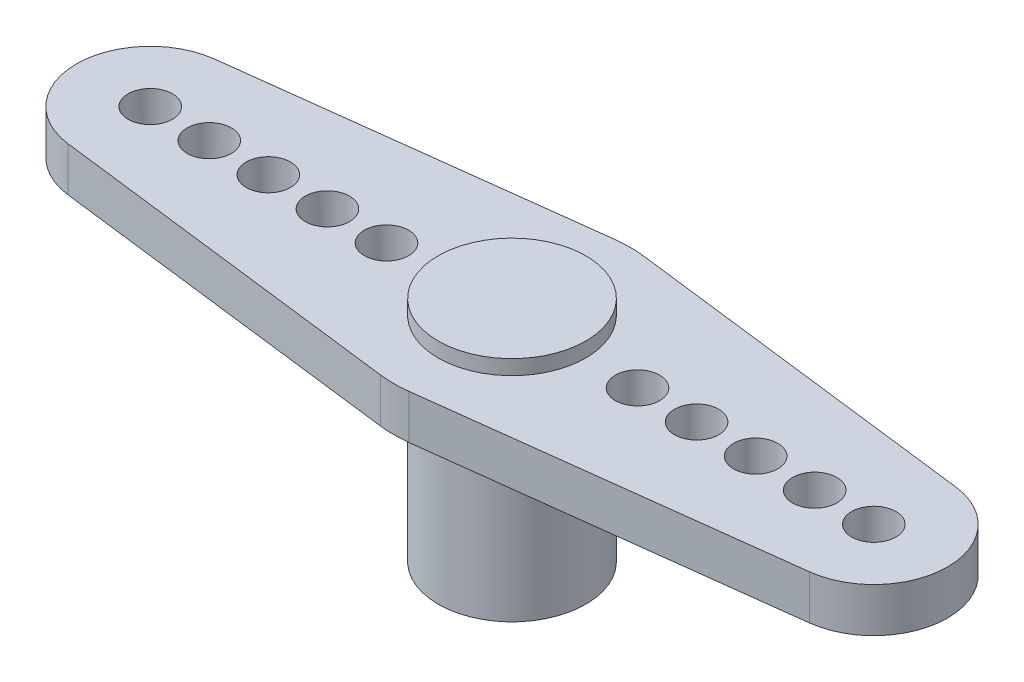
ISO-10303-21;
HEADER;
FILE_DESCRIPTION(('STEP AP214'),'2;1');
FILE_NAME('part.step','',(''),(''),'','','');
FILE_SCHEMA(('AUTOMOTIVE_DESIGN { 1 0 10303 214 1 1 1 1 }'));
ENDSEC;
DATA;
#1=APPLICATION_CONTEXT('core data for automotive mechanical design processes');
#2=APPLICATION_PROTOCOL_DEFINITION('international standard','automotive_design',2000,#1);
#3=PRODUCT_CONTEXT('',#1,'mechanical');
#4=PRODUCT('Part','Part','',(#3));
#5=PRODUCT_RELATED_PRODUCT_CATEGORY('part','',(#4));
#6=PRODUCT_DEFINITION_FORMATION('','',#4);
#7=PRODUCT_DEFINITION_CONTEXT('part definition',#1,'design');
#8=PRODUCT_DEFINITION('design','',#6,#7);
#9=PRODUCT_DEFINITION_SHAPE('','',#8);
#10=(LENGTH_UNIT() NAMED_UNIT(*) SI_UNIT(.MILLI.,.METRE.));
#11=(NAMED_UNIT(*) PLANE_ANGLE_UNIT() SI_UNIT($,.RADIAN.));
#12=(NAMED_UNIT(*) SI_UNIT($,.STERADIAN.) SOLID_ANGLE_UNIT());
#13=UNCERTAINTY_MEASURE_WITH_UNIT(LENGTH_MEASURE(1.E-05),#10,'distance_accuracy_value','');
#14=(GEOMETRIC_REPRESENTATION_CONTEXT(3) GLOBAL_UNCERTAINTY_ASSIGNED_CONTEXT((#13)) GLOBAL_UNIT_ASSIGNED_CONTEXT((#10,
#11,#12)) REPRESENTATION_CONTEXT('',''));
#15=CARTESIAN_POINT('',(0.,0.,0.));
#16=DIRECTION('',(0.,0.,1.));
#17=DIRECTION('',(1.,0.,0.));
#18=AXIS2_PLACEMENT_3D('',#15,#16,#17);
#19=CARTESIAN_POINT('',(0.,8.44,0.));
#20=DIRECTION('',(0.,-1.,0.));
#21=DIRECTION('',(0.,0.,-1.));
#22=AXIS2_PLACEMENT_3D('',#19,#20,#21);
#23=CYLINDRICAL_SURFACE('',#22,5.);
#24=CARTESIAN_POINT('',(0.,0.,0.));
#25=DIRECTION('',(0.,1.,0.));
#26=DIRECTION('',(0.,0.,1.));
#27=AXIS2_PLACEMENT_3D('',#24,#25,#26);
#28=CIRCLE('',#27,5.);
#29=CARTESIAN_POINT('',(0.,0.,5.));
#30=VERTEX_POINT('',#29);
#31=EDGE_CURVE('E43',#30,#30,#28,.T.);
#32=ORIENTED_EDGE('',*,*,#31,.T.);
#33=EDGE_LOOP('',(#32));
#34=FACE_BOUND('',#33,.T.);
#35=CARTESIAN_POINT('',(0.,11.44,0.));
#36=DIRECTION('',(0.,1.,0.));
#37=DIRECTION('',(0.,0.,1.));
#38=AXIS2_PLACEMENT_3D('',#35,#36,#37);
#39=CIRCLE('',#38,5.);
#40=CARTESIAN_POINT('',(0.,11.44,5.));
#41=VERTEX_POINT('',#40);
#42=EDGE_CURVE('E11',#41,#41,#39,.T.);
#43=ORIENTED_EDGE('',*,*,#42,.F.);
#44=EDGE_LOOP('',(#43));
#45=FACE_BOUND('',#44,.T.);
#46=ADVANCED_FACE('F35',(#34,#45),#23,.T.);
#47=CARTESIAN_POINT('',(0.,0.,0.));
#48=DIRECTION('',(0.,1.,0.));
#49=DIRECTION('',(0.,0.,1.));
#50=AXIS2_PLACEMENT_3D('',#47,#48,#49);
#51=PLANE('',#50);
#52=ORIENTED_EDGE('',*,*,#31,.F.);
#53=EDGE_LOOP('',(#52));
#54=FACE_BOUND('',#53,.T.);
#55=ADVANCED_FACE('F171',(#54),#51,.F.);
#56=CARTESIAN_POINT('',(0.,11.44,0.));
#57=DIRECTION('',(0.,1.,0.));
#58=DIRECTION('',(0.,0.,1.));
#59=AXIS2_PLACEMENT_3D('',#56,#57,#58);
#60=CYLINDRICAL_SURFACE('',#59,8.00000000000001);
#61=CARTESIAN_POINT('',(0.,14.44,0.));
#62=DIRECTION('',(0.,1.,0.));
#63=DIRECTION('',(0.,0.,1.));
#64=AXIS2_PLACEMENT_3D('',#61,#62,#63);
#65=CIRCLE('',#64,8.00000000000001);
#66=CARTESIAN_POINT('',(-0.979591836734696,14.44,7.93979847561655));
#67=VERTEX_POINT('',#66);
#68=CARTESIAN_POINT('',(0.979591836734696,14.44,7.93979847561655));
#69=VERTEX_POINT('',#68);
#70=EDGE_CURVE('E134',#67,#69,#65,.T.);
#71=ORIENTED_EDGE('',*,*,#70,.F.);
#72=DIRECTION('',(0.,1.,0.));
#73=VECTOR('',#72,1.);
#74=CARTESIAN_POINT('',(-0.979591836734696,11.44,7.93979847561655));
#75=LINE('',#74,#73);
#76=CARTESIAN_POINT('',(-0.979591836734696,11.44,7.93979847561655));
#77=VERTEX_POINT('',#76);
#78=EDGE_CURVE('E51',#77,#67,#75,.T.);
#79=ORIENTED_EDGE('',*,*,#78,.F.);
#80=CARTESIAN_POINT('',(0.,11.44,0.));
#81=DIRECTION('',(0.,1.,0.));
#82=DIRECTION('',(0.,0.,1.));
#83=AXIS2_PLACEMENT_3D('',#80,#81,#82);
#84=CIRCLE('',#83,8.00000000000001);
#85=CARTESIAN_POINT('',(0.979591836734696,11.44,7.93979847561655));
#86=VERTEX_POINT('',#85);
#87=EDGE_CURVE('E156',#77,#86,#84,.T.);
#88=ORIENTED_EDGE('',*,*,#87,.T.);
#89=DIRECTION('',(0.,1.,0.));
#90=VECTOR('',#89,1.);
#91=CARTESIAN_POINT('',(0.979591836734696,11.44,7.93979847561655));
#92=LINE('',#91,#90);
#93=EDGE_CURVE('E92',#86,#69,#92,.T.);
#94=ORIENTED_EDGE('',*,*,#93,.T.);
#95=EDGE_LOOP('',(#71,#79,#88,#94));
#96=FACE_BOUND('',#95,.T.);
#97=ADVANCED_FACE('F173',(#96),#60,.T.);
#98=CARTESIAN_POINT('',(-0.979591836734696,11.44,7.93979847561655));
#99=DIRECTION('',(-0.122448979591837,0.,0.992474809452068));
#100=DIRECTION('',(0.992474809452068,0.,0.122448979591837));
#101=AXIS2_PLACEMENT_3D('',#98,#99,#100);
#102=PLANE('',#101);
#103=DIRECTION('',(0.992474809452068,0.,0.122448979591837));
#104=VECTOR('',#103,1.);
#105=CARTESIAN_POINT('',(-0.979591836734696,14.44,7.93979847561655));
#106=LINE('',#105,#104);
#107=CARTESIAN_POINT('',(-25.1122448979592,14.44,4.96237404726034));
#108=VERTEX_POINT('',#107);
#109=EDGE_CURVE('E153',#108,#67,#106,.T.);
#110=ORIENTED_EDGE('',*,*,#109,.F.);
#111=DIRECTION('',(0.,1.,0.));
#112=VECTOR('',#111,1.);
#113=CARTESIAN_POINT('',(-25.1122448979592,11.44,4.96237404726034));
#114=LINE('',#113,#112);
#115=CARTESIAN_POINT('',(-25.1122448979592,11.44,4.96237404726034));
#116=VERTEX_POINT('',#115);
#117=EDGE_CURVE('E80',#116,#108,#114,.T.);
#118=ORIENTED_EDGE('',*,*,#117,.F.);
#119=DIRECTION('',(0.992474809452068,0.,0.122448979591837));
#120=VECTOR('',#119,1.);
#121=CARTESIAN_POINT('',(-0.979591836734696,11.44,7.93979847561655));
#122=LINE('',#121,#120);
#123=EDGE_CURVE('E124',#116,#77,#122,.T.);
#124=ORIENTED_EDGE('',*,*,#123,.T.);
#125=ORIENTED_EDGE('',*,*,#78,.T.);
#126=EDGE_LOOP('',(#110,#118,#124,#125));
#127=FACE_BOUND('',#126,.T.);
#128=ADVANCED_FACE('F178',(#127),#102,.T.);
#129=CARTESIAN_POINT('',(-24.5,11.44,0.));
#130=DIRECTION('',(0.,1.,0.));
#131=DIRECTION('',(0.,0.,1.));
#132=AXIS2_PLACEMENT_3D('',#129,#130,#131);
#133=CYLINDRICAL_SURFACE('',#132,5.);
#134=CARTESIAN_POINT('',(-24.5,14.44,0.));
#135=DIRECTION('',(0.,1.,0.));
#136=DIRECTION('',(0.,0.,1.));
#137=AXIS2_PLACEMENT_3D('',#134,#135,#136);
#138=CIRCLE('',#137,5.);
#139=CARTESIAN_POINT('',(-25.1122448979592,14.44,-4.96237404726034));
#140=VERTEX_POINT('',#139);
#141=EDGE_CURVE('E111',#140,#108,#138,.T.);
#142=ORIENTED_EDGE('',*,*,#141,.F.);
#143=DIRECTION('',(0.,1.,0.));
#144=VECTOR('',#143,1.);
#145=CARTESIAN_POINT('',(-25.1122448979592,11.44,-4.96237404726034));
#146=LINE('',#145,#144);
#147=CARTESIAN_POINT('',(-25.1122448979592,11.44,-4.96237404726034));
#148=VERTEX_POINT('',#147);
#149=EDGE_CURVE('E106',#148,#140,#146,.T.);
#150=ORIENTED_EDGE('',*,*,#149,.F.);
#151=CARTESIAN_POINT('',(-24.5,11.44,0.));
#152=DIRECTION('',(0.,1.,0.));
#153=DIRECTION('',(0.,0.,1.));
#154=AXIS2_PLACEMENT_3D('',#151,#152,#153);
#155=CIRCLE('',#154,5.);
#156=EDGE_CURVE('E109',#148,#116,#155,.T.);
#157=ORIENTED_EDGE('',*,*,#156,.T.);
#158=ORIENTED_EDGE('',*,*,#117,.T.);
#159=EDGE_LOOP('',(#142,#150,#157,#158));
#160=FACE_BOUND('',#159,.T.);
#161=ADVANCED_FACE('F108',(#160),#133,.T.);
#162=CARTESIAN_POINT('',(-0.979591836734696,11.44,-7.93979847561655));
#163=DIRECTION('',(-0.122448979591837,0.,-0.992474809452068));
#164=DIRECTION('',(-0.992474809452068,0.,0.122448979591837));
#165=AXIS2_PLACEMENT_3D('',#162,#163,#164);
#166=PLANE('',#165);
#167=DIRECTION('',(-0.992474809452068,0.,0.122448979591837));
#168=VECTOR('',#167,1.);
#169=CARTESIAN_POINT('',(-0.979591836734696,14.44,-7.93979847561655));
#170=LINE('',#169,#168);
#171=CARTESIAN_POINT('',(-0.979591836734696,14.44,-7.93979847561655));
#172=VERTEX_POINT('',#171);
#173=EDGE_CURVE('E150',#172,#140,#170,.T.);
#174=ORIENTED_EDGE('',*,*,#173,.F.);
#175=DIRECTION('',(0.,1.,0.));
#176=VECTOR('',#175,1.);
#177=CARTESIAN_POINT('',(-0.979591836734696,11.44,-7.93979847561655));
#178=LINE('',#177,#176);
#179=CARTESIAN_POINT('',(-0.979591836734696,11.44,-7.93979847561655));
#180=VERTEX_POINT('',#179);
#181=EDGE_CURVE('E116',#180,#172,#178,.T.);
#182=ORIENTED_EDGE('',*,*,#181,.F.);
#183=DIRECTION('',(-0.992474809452068,0.,0.122448979591837));
#184=VECTOR('',#183,1.);
#185=CARTESIAN_POINT('',(-0.979591836734696,11.44,-7.93979847561655));
#186=LINE('',#185,#184);
#187=EDGE_CURVE('E122',#180,#148,#186,.T.);
#188=ORIENTED_EDGE('',*,*,#187,.T.);
#189=ORIENTED_EDGE('',*,*,#149,.T.);
#190=EDGE_LOOP('',(#174,#182,#188,#189));
#191=FACE_BOUND('',#190,.T.);
#192=ADVANCED_FACE('F126',(#191),#166,.T.);
#193=CARTESIAN_POINT('',(0.,11.44,0.));
#194=DIRECTION('',(0.,1.,0.));
#195=DIRECTION('',(0.,0.,1.));
#196=AXIS2_PLACEMENT_3D('',#193,#194,#195);
#197=CYLINDRICAL_SURFACE('',#196,8.00000000000001);
#198=CARTESIAN_POINT('',(0.,14.44,0.));
#199=DIRECTION('',(0.,1.,0.));
#200=DIRECTION('',(0.,0.,-1.));
#201=AXIS2_PLACEMENT_3D('',#198,#199,#200);
#202=CIRCLE('',#201,8.00000000000001);
#203=CARTESIAN_POINT('',(0.979591836734698,14.44,-7.93979847561655));
#204=VERTEX_POINT('',#203);
#205=EDGE_CURVE('E147',#204,#172,#202,.T.);
#206=ORIENTED_EDGE('',*,*,#205,.F.);
#207=DIRECTION('',(0.,1.,0.));
#208=VECTOR('',#207,1.);
#209=CARTESIAN_POINT('',(0.979591836734698,11.44,-7.93979847561655));
#210=LINE('',#209,#208);
#211=CARTESIAN_POINT('',(0.979591836734698,11.44,-7.93979847561655));
#212=VERTEX_POINT('',#211);
#213=EDGE_CURVE('E160',#212,#204,#210,.T.);
#214=ORIENTED_EDGE('',*,*,#213,.F.);
#215=CARTESIAN_POINT('',(0.,11.44,0.));
#216=DIRECTION('',(0.,1.,0.));
#217=DIRECTION('',(0.,0.,-1.));
#218=AXIS2_PLACEMENT_3D('',#215,#216,#217);
#219=CIRCLE('',#218,8.00000000000001);
#220=EDGE_CURVE('E127',#212,#180,#219,.T.);
#221=ORIENTED_EDGE('',*,*,#220,.T.);
#222=ORIENTED_EDGE('',*,*,#181,.T.);
#223=EDGE_LOOP('',(#206,#214,#221,#222));
#224=FACE_BOUND('',#223,.T.);
#225=ADVANCED_FACE('F196',(#224),#197,.T.);
#226=CARTESIAN_POINT('',(0.979591836734696,11.44,-7.93979847561655));
#227=DIRECTION('',(0.122448979591837,0.,-0.992474809452068));
#228=DIRECTION('',(-0.992474809452068,0.,-0.122448979591837));
#229=AXIS2_PLACEMENT_3D('',#226,#227,#228);
#230=PLANE('',#229);
#231=DIRECTION('',(-0.992474809452068,0.,-0.122448979591837));
#232=VECTOR('',#231,1.);
#233=CARTESIAN_POINT('',(0.979591836734696,14.44,-7.93979847561655));
#234=LINE('',#233,#232);
#235=CARTESIAN_POINT('',(25.1122448979592,14.44,-4.96237404726034));
#236=VERTEX_POINT('',#235);
#237=EDGE_CURVE('E144',#236,#204,#234,.T.);
#238=ORIENTED_EDGE('',*,*,#237,.F.);
#239=DIRECTION('',(0.,1.,0.));
#240=VECTOR('',#239,1.);
#241=CARTESIAN_POINT('',(25.1122448979592,11.44,-4.96237404726034));
#242=LINE('',#241,#240);
#243=CARTESIAN_POINT('',(25.1122448979592,11.44,-4.96237404726034));
#244=VERTEX_POINT('',#243);
#245=EDGE_CURVE('E162',#244,#236,#242,.T.);
#246=ORIENTED_EDGE('',*,*,#245,.F.);
#247=DIRECTION('',(-0.992474809452068,0.,-0.122448979591837));
#248=VECTOR('',#247,1.);
#249=CARTESIAN_POINT('',(0.979591836734696,11.44,-7.93979847561655));
#250=LINE('',#249,#248);
#251=EDGE_CURVE('E129',#244,#212,#250,.T.);
#252=ORIENTED_EDGE('',*,*,#251,.T.);
#253=ORIENTED_EDGE('',*,*,#213,.T.);
#254=EDGE_LOOP('',(#238,#246,#252,#253));
#255=FACE_BOUND('',#254,.T.);
#256=ADVANCED_FACE('F192',(#255),#230,.T.);
#257=CARTESIAN_POINT('',(24.5,11.44,0.));
#258=DIRECTION('',(0.,1.,0.));
#259=DIRECTION('',(0.,0.,1.));
#260=AXIS2_PLACEMENT_3D('',#257,#258,#259);
#261=CYLINDRICAL_SURFACE('',#260,5.);
#262=CARTESIAN_POINT('',(24.5,14.44,0.));
#263=DIRECTION('',(0.,1.,0.));
#264=DIRECTION('',(0.,0.,-1.));
#265=AXIS2_PLACEMENT_3D('',#262,#263,#264);
#266=CIRCLE('',#265,5.);
#267=CARTESIAN_POINT('',(25.1122448979592,14.44,4.96237404726034));
#268=VERTEX_POINT('',#267);
#269=EDGE_CURVE('E141',#268,#236,#266,.T.);
#270=ORIENTED_EDGE('',*,*,#269,.F.);
#271=DIRECTION('',(0.,1.,0.));
#272=VECTOR('',#271,1.);
#273=CARTESIAN_POINT('',(25.1122448979592,11.44,4.96237404726034));
#274=LINE('',#273,#272);
#275=CARTESIAN_POINT('',(25.1122448979592,11.44,4.96237404726034));
#276=VERTEX_POINT('',#275);
#277=EDGE_CURVE('E164',#276,#268,#274,.T.);
#278=ORIENTED_EDGE('',*,*,#277,.F.);
#279=CARTESIAN_POINT('',(24.5,11.44,0.));
#280=DIRECTION('',(0.,1.,0.));
#281=DIRECTION('',(0.,0.,-1.));
#282=AXIS2_PLACEMENT_3D('',#279,#280,#281);
#283=CIRCLE('',#282,5.);
#284=EDGE_CURVE('E328',#276,#244,#283,.T.);
#285=ORIENTED_EDGE('',*,*,#284,.T.);
#286=ORIENTED_EDGE('',*,*,#245,.T.);
#287=EDGE_LOOP('',(#270,#278,#285,#286));
#288=FACE_BOUND('',#287,.T.);
#289=ADVANCED_FACE('F189',(#288),#261,.T.);
#290=CARTESIAN_POINT('',(0.979591836734696,11.44,7.93979847561655));
#291=DIRECTION('',(0.122448979591837,0.,0.992474809452068));
#292=DIRECTION('',(0.992474809452068,0.,-0.122448979591837));
#293=AXIS2_PLACEMENT_3D('',#290,#291,#292);
#294=PLANE('',#293);
#295=DIRECTION('',(0.992474809452068,0.,-0.122448979591837));
#296=VECTOR('',#295,1.);
#297=CARTESIAN_POINT('',(0.979591836734696,14.44,7.93979847561655));
#298=LINE('',#297,#296);
#299=EDGE_CURVE('E137',#69,#268,#298,.T.);
#300=ORIENTED_EDGE('',*,*,#299,.F.);
#301=ORIENTED_EDGE('',*,*,#93,.F.);
#302=DIRECTION('',(0.992474809452068,0.,-0.122448979591837));
#303=VECTOR('',#302,1.);
#304=CARTESIAN_POINT('',(0.979591836734696,11.44,7.93979847561655));
#305=LINE('',#304,#303);
#306=EDGE_CURVE('E326',#86,#276,#305,.T.);
#307=ORIENTED_EDGE('',*,*,#306,.T.);
#308=ORIENTED_EDGE('',*,*,#277,.T.);
#309=EDGE_LOOP('',(#300,#301,#307,#308));
#310=FACE_BOUND('',#309,.T.);
#311=ADVANCED_FACE('F186',(#310),#294,.T.);
#312=CARTESIAN_POINT('',(0.,11.44,0.));
#313=DIRECTION('',(0.,1.,0.));
#314=DIRECTION('',(0.,0.,1.));
#315=AXIS2_PLACEMENT_3D('',#312,#313,#314);
#316=PLANE('',#315);
#317=CARTESIAN_POINT('',(-20.5,11.44,0.));
#318=DIRECTION('',(0.,1.,0.));
#319=DIRECTION('',(0.,0.,1.));
#320=AXIS2_PLACEMENT_3D('',#317,#318,#319);
#321=CIRCLE('',#320,1.5);
#322=CARTESIAN_POINT('',(-20.5,11.44,1.50000000000002));
#323=VERTEX_POINT('',#322);
#324=EDGE_CURVE('E265',#323,#323,#321,.F.);
#325=ORIENTED_EDGE('',*,*,#324,.F.);
#326=EDGE_LOOP('',(#325));
#327=FACE_BOUND('',#326,.T.);
#328=CARTESIAN_POINT('',(-16.5,11.44,0.));
#329=DIRECTION('',(0.,1.,0.));
#330=DIRECTION('',(0.,0.,1.));
#331=AXIS2_PLACEMENT_3D('',#328,#329,#330);
#332=CIRCLE('',#331,1.5);
#333=CARTESIAN_POINT('',(-16.5,11.44,1.50000000000006));
#334=VERTEX_POINT('',#333);
#335=EDGE_CURVE('E275',#334,#334,#332,.F.);
#336=ORIENTED_EDGE('',*,*,#335,.F.);
#337=EDGE_LOOP('',(#336));
#338=FACE_BOUND('',#337,.T.);
#339=CARTESIAN_POINT('',(-12.5,11.44,0.));
#340=DIRECTION('',(0.,1.,0.));
#341=DIRECTION('',(0.,0.,1.));
#342=AXIS2_PLACEMENT_3D('',#339,#340,#341);
#343=CIRCLE('',#342,1.5);
#344=CARTESIAN_POINT('',(-12.5,11.44,1.50000000000009));
#345=VERTEX_POINT('',#344);
#346=EDGE_CURVE('E281',#345,#345,#343,.F.);
#347=ORIENTED_EDGE('',*,*,#346,.F.);
#348=EDGE_LOOP('',(#347));
#349=FACE_BOUND('',#348,.T.);
#350=CARTESIAN_POINT('',(-8.50000000000001,11.44,1.1172740284298E-13));
#351=DIRECTION('',(0.,1.,0.));
#352=DIRECTION('',(0.,0.,1.));
#353=AXIS2_PLACEMENT_3D('',#350,#351,#352);
#354=CIRCLE('',#353,1.5);
#355=CARTESIAN_POINT('',(-8.50000000000001,11.44,1.50000000000012));
#356=VERTEX_POINT('',#355);
#357=EDGE_CURVE('E287',#356,#356,#354,.F.);
#358=ORIENTED_EDGE('',*,*,#357,.F.);
#359=EDGE_LOOP('',(#358));
#360=FACE_BOUND('',#359,.T.);
#361=CARTESIAN_POINT('',(8.50000000000001,11.44,1.1172740284298E-13));
#362=DIRECTION('',(0.,1.,0.));
#363=DIRECTION('',(0.,0.,1.));
#364=AXIS2_PLACEMENT_3D('',#361,#362,#363);
#365=CIRCLE('',#364,1.5);
#366=CARTESIAN_POINT('',(8.50000000000001,11.44,1.50000000000012));
#367=VERTEX_POINT('',#366);
#368=EDGE_CURVE('E293',#367,#367,#365,.F.);
#369=ORIENTED_EDGE('',*,*,#368,.F.);
#370=EDGE_LOOP('',(#369));
#371=FACE_BOUND('',#370,.T.);
#372=CARTESIAN_POINT('',(12.5,11.44,0.));
#373=DIRECTION('',(0.,1.,0.));
#374=DIRECTION('',(0.,0.,1.));
#375=AXIS2_PLACEMENT_3D('',#372,#373,#374);
#376=CIRCLE('',#375,1.5);
#377=CARTESIAN_POINT('',(12.5,11.44,1.50000000000009));
#378=VERTEX_POINT('',#377);
#379=EDGE_CURVE('E299',#378,#378,#376,.F.);
#380=ORIENTED_EDGE('',*,*,#379,.F.);
#381=EDGE_LOOP('',(#380));
#382=FACE_BOUND('',#381,.T.);
#383=CARTESIAN_POINT('',(16.5,11.44,0.));
#384=DIRECTION('',(0.,1.,0.));
#385=DIRECTION('',(0.,0.,1.));
#386=AXIS2_PLACEMENT_3D('',#383,#384,#385);
#387=CIRCLE('',#386,1.5);
#388=CARTESIAN_POINT('',(16.5,11.44,1.50000000000006));
#389=VERTEX_POINT('',#388);
#390=EDGE_CURVE('E305',#389,#389,#387,.F.);
#391=ORIENTED_EDGE('',*,*,#390,.F.);
#392=EDGE_LOOP('',(#391));
#393=FACE_BOUND('',#392,.T.);
#394=CARTESIAN_POINT('',(20.5,11.44,0.));
#395=DIRECTION('',(0.,1.,0.));
#396=DIRECTION('',(0.,0.,1.));
#397=AXIS2_PLACEMENT_3D('',#394,#395,#396);
#398=CIRCLE('',#397,1.5);
#399=CARTESIAN_POINT('',(20.5,11.44,1.50000000000002));
#400=VERTEX_POINT('',#399);
#401=EDGE_CURVE('E311',#400,#400,#398,.F.);
#402=ORIENTED_EDGE('',*,*,#401,.F.);
#403=EDGE_LOOP('',(#402));
#404=FACE_BOUND('',#403,.T.);
#405=CARTESIAN_POINT('',(-24.5,11.44,0.));
#406=DIRECTION('',(0.,1.,0.));
#407=DIRECTION('',(0.,0.,1.));
#408=AXIS2_PLACEMENT_3D('',#405,#406,#407);
#409=CIRCLE('',#408,1.5);
#410=CARTESIAN_POINT('',(-24.5,11.44,1.5));
#411=VERTEX_POINT('',#410);
#412=EDGE_CURVE('E317',#411,#411,#409,.F.);
#413=ORIENTED_EDGE('',*,*,#412,.F.);
#414=EDGE_LOOP('',(#413));
#415=FACE_BOUND('',#414,.T.);
#416=CARTESIAN_POINT('',(24.5,11.44,0.));
#417=DIRECTION('',(0.,1.,0.));
#418=DIRECTION('',(0.,0.,1.));
#419=AXIS2_PLACEMENT_3D('',#416,#417,#418);
#420=CIRCLE('',#419,1.5);
#421=CARTESIAN_POINT('',(24.5,11.44,1.5));
#422=VERTEX_POINT('',#421);
#423=EDGE_CURVE('E138',#422,#422,#420,.F.);
#424=ORIENTED_EDGE('',*,*,#423,.F.);
#425=EDGE_LOOP('',(#424));
#426=FACE_BOUND('',#425,.T.);
#427=ORIENTED_EDGE('',*,*,#42,.T.);
#428=EDGE_LOOP('',(#427));
#429=FACE_BOUND('',#428,.T.);
#430=ORIENTED_EDGE('',*,*,#87,.F.);
#431=ORIENTED_EDGE('',*,*,#123,.F.);
#432=ORIENTED_EDGE('',*,*,#156,.F.);
#433=ORIENTED_EDGE('',*,*,#187,.F.);
#434=ORIENTED_EDGE('',*,*,#220,.F.);
#435=ORIENTED_EDGE('',*,*,#251,.F.);
#436=ORIENTED_EDGE('',*,*,#284,.F.);
#437=ORIENTED_EDGE('',*,*,#306,.F.);
#438=EDGE_LOOP('',(#430,#431,#432,#433,#434,#435,#436,#437));
#439=FACE_BOUND('',#438,.T.);
#440=ADVANCED_FACE('F120',(#327,#338,#349,#360,#371,#382,#393,#404,#415,#426,#429,#439),#316,.F.);
#441=CARTESIAN_POINT('',(0.,14.44,0.));
#442=DIRECTION('',(0.,1.,0.));
#443=DIRECTION('',(0.,0.,1.));
#444=AXIS2_PLACEMENT_3D('',#441,#442,#443);
#445=PLANE('',#444);
#446=CARTESIAN_POINT('',(0.,14.44,0.));
#447=DIRECTION('',(0.,1.,0.));
#448=DIRECTION('',(0.,0.,1.));
#449=AXIS2_PLACEMENT_3D('',#446,#447,#448);
#450=CIRCLE('',#449,5.);
#451=CARTESIAN_POINT('',(0.,14.44,5.));
#452=VERTEX_POINT('',#451);
#453=EDGE_CURVE('E262',#452,#452,#450,.T.);
#454=ORIENTED_EDGE('',*,*,#453,.F.);
#455=EDGE_LOOP('',(#454));
#456=FACE_BOUND('',#455,.T.);
#457=CARTESIAN_POINT('',(-20.5,14.44,0.));
#458=DIRECTION('',(0.,1.,0.));
#459=DIRECTION('',(0.,0.,-1.));
#460=AXIS2_PLACEMENT_3D('',#457,#458,#459);
#461=CIRCLE('',#460,1.5);
#462=CARTESIAN_POINT('',(-20.5,14.44,-1.49999999999997));
#463=VERTEX_POINT('',#462);
#464=EDGE_CURVE('E261',#463,#463,#461,.T.);
#465=ORIENTED_EDGE('',*,*,#464,.F.);
#466=EDGE_LOOP('',(#465));
#467=FACE_BOUND('',#466,.T.);
#468=CARTESIAN_POINT('',(-16.5,14.44,0.));
#469=DIRECTION('',(0.,1.,0.));
#470=DIRECTION('',(0.,0.,-1.));
#471=AXIS2_PLACEMENT_3D('',#468,#469,#470);
#472=CIRCLE('',#471,1.5);
#473=CARTESIAN_POINT('',(-16.5,14.44,-1.49999999999995));
#474=VERTEX_POINT('',#473);
#475=EDGE_CURVE('E272',#474,#474,#472,.T.);
#476=ORIENTED_EDGE('',*,*,#475,.F.);
#477=EDGE_LOOP('',(#476));
#478=FACE_BOUND('',#477,.T.);
#479=CARTESIAN_POINT('',(-12.5,14.44,0.));
#480=DIRECTION('',(0.,1.,0.));
#481=DIRECTION('',(0.,0.,-1.));
#482=AXIS2_PLACEMENT_3D('',#479,#480,#481);
#483=CIRCLE('',#482,1.5);
#484=CARTESIAN_POINT('',(-12.5,14.44,-1.49999999999992));
#485=VERTEX_POINT('',#484);
#486=EDGE_CURVE('E278',#485,#485,#483,.T.);
#487=ORIENTED_EDGE('',*,*,#486,.F.);
#488=EDGE_LOOP('',(#487));
#489=FACE_BOUND('',#488,.T.);
#490=CARTESIAN_POINT('',(-8.50000000000001,14.44,1.1172740284298E-13));
#491=DIRECTION('',(0.,1.,0.));
#492=DIRECTION('',(0.,0.,-1.));
#493=AXIS2_PLACEMENT_3D('',#490,#491,#492);
#494=CIRCLE('',#493,1.5);
#495=CARTESIAN_POINT('',(-8.50000000000001,14.44,-1.49999999999989));
#496=VERTEX_POINT('',#495);
#497=EDGE_CURVE('E284',#496,#496,#494,.T.);
#498=ORIENTED_EDGE('',*,*,#497,.F.);
#499=EDGE_LOOP('',(#498));
#500=FACE_BOUND('',#499,.T.);
#501=CARTESIAN_POINT('',(8.50000000000001,14.44,1.1172740284298E-13));
#502=DIRECTION('',(0.,1.,0.));
#503=DIRECTION('',(0.,0.,1.));
#504=AXIS2_PLACEMENT_3D('',#501,#502,#503);
#505=CIRCLE('',#504,1.5);
#506=CARTESIAN_POINT('',(8.50000000000001,14.44,1.50000000000012));
#507=VERTEX_POINT('',#506);
#508=EDGE_CURVE('E290',#507,#507,#505,.T.);
#509=ORIENTED_EDGE('',*,*,#508,.F.);
#510=EDGE_LOOP('',(#509));
#511=FACE_BOUND('',#510,.T.);
#512=CARTESIAN_POINT('',(12.5,14.44,0.));
#513=DIRECTION('',(0.,1.,0.));
#514=DIRECTION('',(0.,0.,1.));
#515=AXIS2_PLACEMENT_3D('',#512,#513,#514);
#516=CIRCLE('',#515,1.5);
#517=CARTESIAN_POINT('',(12.5,14.44,1.50000000000009));
#518=VERTEX_POINT('',#517);
#519=EDGE_CURVE('E296',#518,#518,#516,.T.);
#520=ORIENTED_EDGE('',*,*,#519,.F.);
#521=EDGE_LOOP('',(#520));
#522=FACE_BOUND('',#521,.T.);
#523=CARTESIAN_POINT('',(16.5,14.44,0.));
#524=DIRECTION('',(0.,1.,0.));
#525=DIRECTION('',(0.,0.,1.));
#526=AXIS2_PLACEMENT_3D('',#523,#524,#525);
#527=CIRCLE('',#526,1.5);
#528=CARTESIAN_POINT('',(16.5,14.44,1.50000000000006));
#529=VERTEX_POINT('',#528);
#530=EDGE_CURVE('E302',#529,#529,#527,.T.);
#531=ORIENTED_EDGE('',*,*,#530,.F.);
#532=EDGE_LOOP('',(#531));
#533=FACE_BOUND('',#532,.T.);
#534=CARTESIAN_POINT('',(20.5,14.44,0.));
#535=DIRECTION('',(0.,1.,0.));
#536=DIRECTION('',(0.,0.,1.));
#537=AXIS2_PLACEMENT_3D('',#534,#535,#536);
#538=CIRCLE('',#537,1.5);
#539=CARTESIAN_POINT('',(20.5,14.44,1.50000000000002));
#540=VERTEX_POINT('',#539);
#541=EDGE_CURVE('E308',#540,#540,#538,.T.);
#542=ORIENTED_EDGE('',*,*,#541,.F.);
#543=EDGE_LOOP('',(#542));
#544=FACE_BOUND('',#543,.T.);
#545=CARTESIAN_POINT('',(-24.5,14.44,0.));
#546=DIRECTION('',(0.,1.,0.));
#547=DIRECTION('',(0.,0.,-1.));
#548=AXIS2_PLACEMENT_3D('',#545,#546,#547);
#549=CIRCLE('',#548,1.5);
#550=CARTESIAN_POINT('',(-24.5,14.44,-1.5));
#551=VERTEX_POINT('',#550);
#552=EDGE_CURVE('E314',#551,#551,#549,.T.);
#553=ORIENTED_EDGE('',*,*,#552,.F.);
#554=EDGE_LOOP('',(#553));
#555=FACE_BOUND('',#554,.T.);
#556=CARTESIAN_POINT('',(24.5,14.44,0.));
#557=DIRECTION('',(0.,1.,0.));
#558=DIRECTION('',(0.,0.,1.));
#559=AXIS2_PLACEMENT_3D('',#556,#557,#558);
#560=CIRCLE('',#559,1.5);
#561=CARTESIAN_POINT('',(24.5,14.44,1.5));
#562=VERTEX_POINT('',#561);
#563=EDGE_CURVE('E320',#562,#562,#560,.T.);
#564=ORIENTED_EDGE('',*,*,#563,.F.);
#565=EDGE_LOOP('',(#564));
#566=FACE_BOUND('',#565,.T.);
#567=ORIENTED_EDGE('',*,*,#70,.T.);
#568=ORIENTED_EDGE('',*,*,#299,.T.);
#569=ORIENTED_EDGE('',*,*,#269,.T.);
#570=ORIENTED_EDGE('',*,*,#237,.T.);
#571=ORIENTED_EDGE('',*,*,#205,.T.);
#572=ORIENTED_EDGE('',*,*,#173,.T.);
#573=ORIENTED_EDGE('',*,*,#141,.T.);
#574=ORIENTED_EDGE('',*,*,#109,.T.);
#575=EDGE_LOOP('',(#567,#568,#569,#570,#571,#572,#573,#574));
#576=FACE_BOUND('',#575,.T.);
#577=ADVANCED_FACE('F181',(#456,#467,#478,#489,#500,#511,#522,#533,#544,#555,#566,#576),#445,.T.);
#578=CARTESIAN_POINT('',(24.5,-0.000999999999999265,0.));
#579=DIRECTION('',(0.,1.,0.));
#580=DIRECTION('',(0.,0.,1.));
#581=AXIS2_PLACEMENT_3D('',#578,#579,#580);
#582=CYLINDRICAL_SURFACE('',#581,1.5);
#583=ORIENTED_EDGE('',*,*,#563,.T.);
#584=EDGE_LOOP('',(#583));
#585=FACE_BOUND('',#584,.T.);
#586=ORIENTED_EDGE('',*,*,#423,.T.);
#587=EDGE_LOOP('',(#586));
#588=FACE_BOUND('',#587,.T.);
#589=ADVANCED_FACE('F183',(#585,#588),#582,.F.);
#590=CARTESIAN_POINT('',(-24.5,-0.000999999999999265,0.));
#591=DIRECTION('',(0.,1.,0.));
#592=DIRECTION('',(0.,0.,1.));
#593=AXIS2_PLACEMENT_3D('',#590,#591,#592);
#594=CYLINDRICAL_SURFACE('',#593,1.5);
#595=ORIENTED_EDGE('',*,*,#552,.T.);
#596=EDGE_LOOP('',(#595));
#597=FACE_BOUND('',#596,.T.);
#598=ORIENTED_EDGE('',*,*,#412,.T.);
#599=EDGE_LOOP('',(#598));
#600=FACE_BOUND('',#599,.T.);
#601=ADVANCED_FACE('F212',(#597,#600),#594,.F.);
#602=CARTESIAN_POINT('',(20.5,-0.000999999999999265,0.));
#603=DIRECTION('',(0.,1.,0.));
#604=DIRECTION('',(0.,0.,1.));
#605=AXIS2_PLACEMENT_3D('',#602,#603,#604);
#606=CYLINDRICAL_SURFACE('',#605,1.5);
#607=ORIENTED_EDGE('',*,*,#541,.T.);
#608=EDGE_LOOP('',(#607));
#609=FACE_BOUND('',#608,.T.);
#610=ORIENTED_EDGE('',*,*,#401,.T.);
#611=EDGE_LOOP('',(#610));
#612=FACE_BOUND('',#611,.T.);
#613=ADVANCED_FACE('F216',(#609,#612),#606,.F.);
#614=CARTESIAN_POINT('',(16.5,-0.000999999999999265,0.));
#615=DIRECTION('',(0.,1.,0.));
#616=DIRECTION('',(0.,0.,1.));
#617=AXIS2_PLACEMENT_3D('',#614,#615,#616);
#618=CYLINDRICAL_SURFACE('',#617,1.5);
#619=ORIENTED_EDGE('',*,*,#530,.T.);
#620=EDGE_LOOP('',(#619));
#621=FACE_BOUND('',#620,.T.);
#622=ORIENTED_EDGE('',*,*,#390,.T.);
#623=EDGE_LOOP('',(#622));
#624=FACE_BOUND('',#623,.T.);
#625=ADVANCED_FACE('F220',(#621,#624),#618,.F.);
#626=CARTESIAN_POINT('',(12.5,-0.000999999999999265,0.));
#627=DIRECTION('',(0.,1.,0.));
#628=DIRECTION('',(0.,0.,1.));
#629=AXIS2_PLACEMENT_3D('',#626,#627,#628);
#630=CYLINDRICAL_SURFACE('',#629,1.5);
#631=ORIENTED_EDGE('',*,*,#519,.T.);
#632=EDGE_LOOP('',(#631));
#633=FACE_BOUND('',#632,.T.);
#634=ORIENTED_EDGE('',*,*,#379,.T.);
#635=EDGE_LOOP('',(#634));
#636=FACE_BOUND('',#635,.T.);
#637=ADVANCED_FACE('F224',(#633,#636),#630,.F.);
#638=CARTESIAN_POINT('',(8.50000000000001,-0.000999999999999265,1.1172740284298E-13));
#639=DIRECTION('',(0.,1.,0.));
#640=DIRECTION('',(0.,0.,1.));
#641=AXIS2_PLACEMENT_3D('',#638,#639,#640);
#642=CYLINDRICAL_SURFACE('',#641,1.5);
#643=ORIENTED_EDGE('',*,*,#508,.T.);
#644=EDGE_LOOP('',(#643));
#645=FACE_BOUND('',#644,.T.);
#646=ORIENTED_EDGE('',*,*,#368,.T.);
#647=EDGE_LOOP('',(#646));
#648=FACE_BOUND('',#647,.T.);
#649=ADVANCED_FACE('F228',(#645,#648),#642,.F.);
#650=CARTESIAN_POINT('',(-8.50000000000001,-0.000999999999999265,1.1172740284298E-13));
#651=DIRECTION('',(0.,1.,0.));
#652=DIRECTION('',(0.,0.,1.));
#653=AXIS2_PLACEMENT_3D('',#650,#651,#652);
#654=CYLINDRICAL_SURFACE('',#653,1.5);
#655=ORIENTED_EDGE('',*,*,#497,.T.);
#656=EDGE_LOOP('',(#655));
#657=FACE_BOUND('',#656,.T.);
#658=ORIENTED_EDGE('',*,*,#357,.T.);
#659=EDGE_LOOP('',(#658));
#660=FACE_BOUND('',#659,.T.);
#661=ADVANCED_FACE('F232',(#657,#660),#654,.F.);
#662=CARTESIAN_POINT('',(-12.5,-0.000999999999999265,0.));
#663=DIRECTION('',(0.,1.,0.));
#664=DIRECTION('',(0.,0.,1.));
#665=AXIS2_PLACEMENT_3D('',#662,#663,#664);
#666=CYLINDRICAL_SURFACE('',#665,1.5);
#667=ORIENTED_EDGE('',*,*,#486,.T.);
#668=EDGE_LOOP('',(#667));
#669=FACE_BOUND('',#668,.T.);
#670=ORIENTED_EDGE('',*,*,#346,.T.);
#671=EDGE_LOOP('',(#670));
#672=FACE_BOUND('',#671,.T.);
#673=ADVANCED_FACE('F236',(#669,#672),#666,.F.);
#674=CARTESIAN_POINT('',(-16.5,-0.000999999999999265,0.));
#675=DIRECTION('',(0.,1.,0.));
#676=DIRECTION('',(0.,0.,1.));
#677=AXIS2_PLACEMENT_3D('',#674,#675,#676);
#678=CYLINDRICAL_SURFACE('',#677,1.5);
#679=ORIENTED_EDGE('',*,*,#475,.T.);
#680=EDGE_LOOP('',(#679));
#681=FACE_BOUND('',#680,.T.);
#682=ORIENTED_EDGE('',*,*,#335,.T.);
#683=EDGE_LOOP('',(#682));
#684=FACE_BOUND('',#683,.T.);
#685=ADVANCED_FACE('F240',(#681,#684),#678,.F.);
#686=CARTESIAN_POINT('',(-20.5,-0.000999999999999265,0.));
#687=DIRECTION('',(0.,1.,0.));
#688=DIRECTION('',(0.,0.,1.));
#689=AXIS2_PLACEMENT_3D('',#686,#687,#688);
#690=CYLINDRICAL_SURFACE('',#689,1.5);
#691=ORIENTED_EDGE('',*,*,#464,.T.);
#692=EDGE_LOOP('',(#691));
#693=FACE_BOUND('',#692,.T.);
#694=ORIENTED_EDGE('',*,*,#324,.T.);
#695=EDGE_LOOP('',(#694));
#696=FACE_BOUND('',#695,.T.);
#697=ADVANCED_FACE('F244',(#693,#696),#690,.F.);
#698=CARTESIAN_POINT('',(0.,15.44,0.));
#699=DIRECTION('',(0.,-1.,0.));
#700=DIRECTION('',(0.,0.,-1.));
#701=AXIS2_PLACEMENT_3D('',#698,#699,#700);
#702=CYLINDRICAL_SURFACE('',#701,5.);
#703=CARTESIAN_POINT('',(0.,15.44,0.));
#704=DIRECTION('',(0.,1.,0.));
#705=DIRECTION('',(0.,0.,1.));
#706=AXIS2_PLACEMENT_3D('',#703,#704,#705);
#707=CIRCLE('',#706,5.);
#708=CARTESIAN_POINT('',(0.,15.44,5.));
#709=VERTEX_POINT('',#708);
#710=EDGE_CURVE('E260',#709,#709,#707,.T.);
#711=ORIENTED_EDGE('',*,*,#710,.F.);
#712=EDGE_LOOP('',(#711));
#713=FACE_BOUND('',#712,.T.);
#714=ORIENTED_EDGE('',*,*,#453,.T.);
#715=EDGE_LOOP('',(#714));
#716=FACE_BOUND('',#715,.T.);
#717=ADVANCED_FACE('F248',(#713,#716),#702,.T.);
#718=CARTESIAN_POINT('',(0.,15.44,0.));
#719=DIRECTION('',(0.,1.,0.));
#720=DIRECTION('',(0.,0.,1.));
#721=AXIS2_PLACEMENT_3D('',#718,#719,#720);
#722=PLANE('',#721);
#723=ORIENTED_EDGE('',*,*,#710,.T.);
#724=EDGE_LOOP('',(#723));
#725=FACE_BOUND('',#724,.T.);
#726=ADVANCED_FACE('F252',(#725),#722,.T.);
#727=CLOSED_SHELL('',(#46,#55,#97,#128,#161,#192,#225,#256,#289,#311,#440,#577,#589,#601,#613,
#625,#637,#649,#661,#673,#685,#697,#717,#726));
#728=MANIFOLD_SOLID_BREP('B2',#727);
#729=ADVANCED_BREP_SHAPE_REPRESENTATION('',(#18,#728),#14);
#730=SHAPE_DEFINITION_REPRESENTATION(#9,#729);
ENDSEC;
END-ISO-10303-21;
